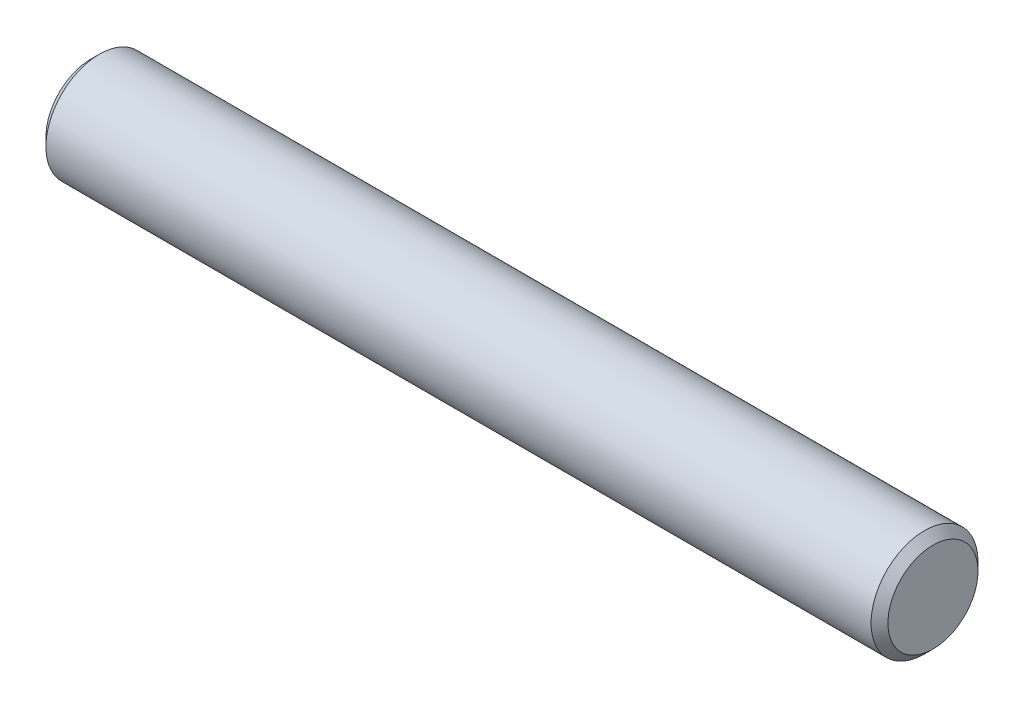
ISO-10303-21;
HEADER;
FILE_DESCRIPTION(('STEP AP214'),'2;1');
FILE_NAME('part.step','',(''),(''),'','','');
FILE_SCHEMA(('AUTOMOTIVE_DESIGN { 1 0 10303 214 1 1 1 1 }'));
ENDSEC;
DATA;
#1=APPLICATION_CONTEXT('core data for automotive mechanical design processes');
#2=APPLICATION_PROTOCOL_DEFINITION('international standard','automotive_design',2000,#1);
#3=PRODUCT_CONTEXT('',#1,'mechanical');
#4=PRODUCT('Part','Part','',(#3));
#5=PRODUCT_RELATED_PRODUCT_CATEGORY('part','',(#4));
#6=PRODUCT_DEFINITION_FORMATION('','',#4);
#7=PRODUCT_DEFINITION_CONTEXT('part definition',#1,'design');
#8=PRODUCT_DEFINITION('design','',#6,#7);
#9=PRODUCT_DEFINITION_SHAPE('','',#8);
#10=(LENGTH_UNIT() NAMED_UNIT(*) SI_UNIT(.MILLI.,.METRE.));
#11=(NAMED_UNIT(*) PLANE_ANGLE_UNIT() SI_UNIT($,.RADIAN.));
#12=(NAMED_UNIT(*) SI_UNIT($,.STERADIAN.) SOLID_ANGLE_UNIT());
#13=UNCERTAINTY_MEASURE_WITH_UNIT(LENGTH_MEASURE(1.E-05),#10,'distance_accuracy_value','');
#14=(GEOMETRIC_REPRESENTATION_CONTEXT(3) GLOBAL_UNCERTAINTY_ASSIGNED_CONTEXT((#13)) GLOBAL_UNIT_ASSIGNED_CONTEXT((#10,
#11,#12)) REPRESENTATION_CONTEXT('',''));
#15=CARTESIAN_POINT('',(0.,0.,0.));
#16=DIRECTION('',(0.,0.,1.));
#17=DIRECTION('',(1.,0.,0.));
#18=AXIS2_PLACEMENT_3D('',#15,#16,#17);
#19=CARTESIAN_POINT('',(25.,0.,0.));
#20=DIRECTION('',(-1.,0.,0.));
#21=DIRECTION('',(0.,0.,1.));
#22=AXIS2_PLACEMENT_3D('',#19,#20,#21);
#23=CYLINDRICAL_SURFACE('',#22,3.175);
#24=CARTESIAN_POINT('',(24.5,0.,0.));
#25=DIRECTION('',(1.,0.,0.));
#26=DIRECTION('',(0.,0.,-1.));
#27=AXIS2_PLACEMENT_3D('',#24,#25,#26);
#28=CIRCLE('',#27,3.175);
#29=CARTESIAN_POINT('',(24.5,0.,-3.175));
#30=VERTEX_POINT('',#29);
#31=EDGE_CURVE('E39',#30,#30,#28,.F.);
#32=ORIENTED_EDGE('',*,*,#31,.T.);
#33=EDGE_LOOP('',(#32));
#34=FACE_BOUND('',#33,.T.);
#35=CARTESIAN_POINT('',(-24.5,0.,0.));
#36=DIRECTION('',(1.,0.,0.));
#37=DIRECTION('',(0.,0.,-1.));
#38=AXIS2_PLACEMENT_3D('',#35,#36,#37);
#39=CIRCLE('',#38,3.175);
#40=CARTESIAN_POINT('',(-24.5,0.,-3.175));
#41=VERTEX_POINT('',#40);
#42=EDGE_CURVE('E43',#41,#41,#39,.T.);
#43=ORIENTED_EDGE('',*,*,#42,.T.);
#44=EDGE_LOOP('',(#43));
#45=FACE_BOUND('',#44,.T.);
#46=ADVANCED_FACE('F32',(#34,#45),#23,.T.);
#47=CARTESIAN_POINT('',(25.,0.,0.));
#48=DIRECTION('',(1.,0.,0.));
#49=DIRECTION('',(0.,0.,-1.));
#50=AXIS2_PLACEMENT_3D('',#47,#48,#49);
#51=PLANE('',#50);
#52=CARTESIAN_POINT('',(25.,0.,0.));
#53=DIRECTION('',(1.,0.,0.));
#54=DIRECTION('',(0.,0.,-1.));
#55=AXIS2_PLACEMENT_3D('',#52,#53,#54);
#56=CIRCLE('',#55,2.675);
#57=CARTESIAN_POINT('',(25.,0.,-2.675));
#58=VERTEX_POINT('',#57);
#59=EDGE_CURVE('E47',#58,#58,#56,.T.);
#60=ORIENTED_EDGE('',*,*,#59,.T.);
#61=EDGE_LOOP('',(#60));
#62=FACE_BOUND('',#61,.T.);
#63=ADVANCED_FACE('F53',(#62),#51,.T.);
#64=CARTESIAN_POINT('',(-25.,0.,0.));
#65=DIRECTION('',(1.,0.,0.));
#66=DIRECTION('',(0.,0.,-1.));
#67=AXIS2_PLACEMENT_3D('',#64,#65,#66);
#68=PLANE('',#67);
#69=CARTESIAN_POINT('',(-25.,0.,0.));
#70=DIRECTION('',(1.,0.,0.));
#71=DIRECTION('',(0.,0.,-1.));
#72=AXIS2_PLACEMENT_3D('',#69,#70,#71);
#73=CIRCLE('',#72,2.675);
#74=CARTESIAN_POINT('',(-25.,0.,-2.675));
#75=VERTEX_POINT('',#74);
#76=EDGE_CURVE('E10',#75,#75,#73,.F.);
#77=ORIENTED_EDGE('',*,*,#76,.T.);
#78=EDGE_LOOP('',(#77));
#79=FACE_BOUND('',#78,.T.);
#80=ADVANCED_FACE('F57',(#79),#68,.F.);
#81=CARTESIAN_POINT('',(25.,0.,0.));
#82=DIRECTION('',(-1.,0.,0.));
#83=DIRECTION('',(0.,0.,1.));
#84=AXIS2_PLACEMENT_3D('',#81,#82,#83);
#85=CONICAL_SURFACE('',#84,2.675,0.785398163397444);
#86=ORIENTED_EDGE('',*,*,#31,.F.);
#87=EDGE_LOOP('',(#86));
#88=FACE_BOUND('',#87,.T.);
#89=ORIENTED_EDGE('',*,*,#59,.F.);
#90=EDGE_LOOP('',(#89));
#91=FACE_BOUND('',#90,.T.);
#92=ADVANCED_FACE('F55',(#88,#91),#85,.T.);
#93=CARTESIAN_POINT('',(-24.5,0.,0.));
#94=DIRECTION('',(1.,0.,0.));
#95=DIRECTION('',(0.,0.,-1.));
#96=AXIS2_PLACEMENT_3D('',#93,#94,#95);
#97=CONICAL_SURFACE('',#96,3.175,0.785398163397465);
#98=ORIENTED_EDGE('',*,*,#76,.F.);
#99=EDGE_LOOP('',(#98));
#100=FACE_BOUND('',#99,.T.);
#101=ORIENTED_EDGE('',*,*,#42,.F.);
#102=EDGE_LOOP('',(#101));
#103=FACE_BOUND('',#102,.T.);
#104=ADVANCED_FACE('F34',(#100,#103),#97,.T.);
#105=CLOSED_SHELL('',(#46,#63,#80,#92,#104));
#106=MANIFOLD_SOLID_BREP('B2',#105);
#107=ADVANCED_BREP_SHAPE_REPRESENTATION('',(#18,#106),#14);
#108=SHAPE_DEFINITION_REPRESENTATION(#9,#107);
ENDSEC;
END-ISO-10303-21;
